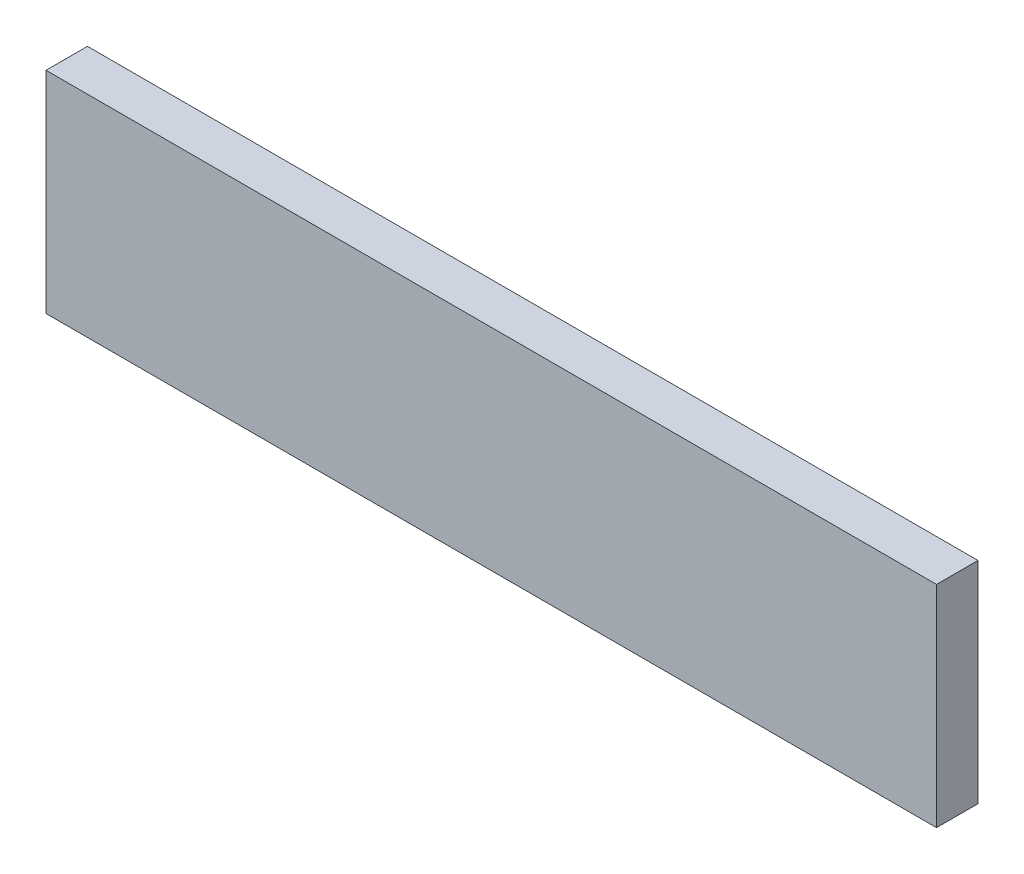
ISO-10303-21;
HEADER;
FILE_DESCRIPTION(('STEP AP214'),'2;1');
FILE_NAME('part.step','',(''),(''),'','','');
FILE_SCHEMA(('AUTOMOTIVE_DESIGN { 1 0 10303 214 1 1 1 1 }'));
ENDSEC;
DATA;
#1=APPLICATION_CONTEXT('core data for automotive mechanical design processes');
#2=APPLICATION_PROTOCOL_DEFINITION('international standard','automotive_design',2000,#1);
#3=PRODUCT_CONTEXT('',#1,'mechanical');
#4=PRODUCT('Part','Part','',(#3));
#5=PRODUCT_RELATED_PRODUCT_CATEGORY('part','',(#4));
#6=PRODUCT_DEFINITION_FORMATION('','',#4);
#7=PRODUCT_DEFINITION_CONTEXT('part definition',#1,'design');
#8=PRODUCT_DEFINITION('design','',#6,#7);
#9=PRODUCT_DEFINITION_SHAPE('','',#8);
#10=(LENGTH_UNIT() NAMED_UNIT(*) SI_UNIT(.MILLI.,.METRE.));
#11=(NAMED_UNIT(*) PLANE_ANGLE_UNIT() SI_UNIT($,.RADIAN.));
#12=(NAMED_UNIT(*) SI_UNIT($,.STERADIAN.) SOLID_ANGLE_UNIT());
#13=UNCERTAINTY_MEASURE_WITH_UNIT(LENGTH_MEASURE(1.E-05),#10,'distance_accuracy_value','');
#14=(GEOMETRIC_REPRESENTATION_CONTEXT(3) GLOBAL_UNCERTAINTY_ASSIGNED_CONTEXT((#13)) GLOBAL_UNIT_ASSIGNED_CONTEXT((#10,
#11,#12)) REPRESENTATION_CONTEXT('',''));
#15=CARTESIAN_POINT('',(0.,0.,0.));
#16=DIRECTION('',(0.,0.,1.));
#17=DIRECTION('',(1.,0.,0.));
#18=AXIS2_PLACEMENT_3D('',#15,#16,#17);
#19=CARTESIAN_POINT('',(0.,0.,15.));
#20=DIRECTION('',(1.,0.,0.));
#21=DIRECTION('',(0.,0.,-1.));
#22=AXIS2_PLACEMENT_3D('',#19,#20,#21);
#23=PLANE('',#22);
#24=DIRECTION('',(0.,-1.,0.));
#25=VECTOR('',#24,1.);
#26=CARTESIAN_POINT('',(0.,0.,0.));
#27=LINE('',#26,#25);
#28=CARTESIAN_POINT('',(0.,76.2,0.));
#29=VERTEX_POINT('',#28);
#30=CARTESIAN_POINT('',(0.,0.,0.));
#31=VERTEX_POINT('',#30);
#32=EDGE_CURVE('E96',#29,#31,#27,.T.);
#33=ORIENTED_EDGE('',*,*,#32,.T.);
#34=DIRECTION('',(0.,0.,-1.));
#35=VECTOR('',#34,1.);
#36=CARTESIAN_POINT('',(0.,0.,15.));
#37=LINE('',#36,#35);
#38=CARTESIAN_POINT('',(0.,0.,15.));
#39=VERTEX_POINT('',#38);
#40=EDGE_CURVE('E11',#39,#31,#37,.T.);
#41=ORIENTED_EDGE('',*,*,#40,.F.);
#42=DIRECTION('',(0.,-1.,0.));
#43=VECTOR('',#42,1.);
#44=CARTESIAN_POINT('',(0.,0.,15.));
#45=LINE('',#44,#43);
#46=CARTESIAN_POINT('',(0.,76.2,15.));
#47=VERTEX_POINT('',#46);
#48=EDGE_CURVE('E84',#47,#39,#45,.T.);
#49=ORIENTED_EDGE('',*,*,#48,.F.);
#50=DIRECTION('',(0.,0.,-1.));
#51=VECTOR('',#50,1.);
#52=CARTESIAN_POINT('',(0.,76.2,15.));
#53=LINE('',#52,#51);
#54=EDGE_CURVE('E92',#47,#29,#53,.T.);
#55=ORIENTED_EDGE('',*,*,#54,.T.);
#56=EDGE_LOOP('',(#33,#41,#49,#55));
#57=FACE_BOUND('',#56,.T.);
#58=ADVANCED_FACE('F33',(#57),#23,.F.);
#59=CARTESIAN_POINT('',(0.,0.,15.));
#60=DIRECTION('',(0.,1.,0.));
#61=DIRECTION('',(0.,0.,1.));
#62=AXIS2_PLACEMENT_3D('',#59,#60,#61);
#63=PLANE('',#62);
#64=DIRECTION('',(1.,0.,0.));
#65=VECTOR('',#64,1.);
#66=CARTESIAN_POINT('',(0.,0.,0.));
#67=LINE('',#66,#65);
#68=CARTESIAN_POINT('',(322.1,0.,0.));
#69=VERTEX_POINT('',#68);
#70=EDGE_CURVE('E88',#31,#69,#67,.T.);
#71=ORIENTED_EDGE('',*,*,#70,.T.);
#72=DIRECTION('',(0.,0.,-1.));
#73=VECTOR('',#72,1.);
#74=CARTESIAN_POINT('',(322.1,0.,15.));
#75=LINE('',#74,#73);
#76=CARTESIAN_POINT('',(322.1,0.,15.));
#77=VERTEX_POINT('',#76);
#78=EDGE_CURVE('E41',#77,#69,#75,.T.);
#79=ORIENTED_EDGE('',*,*,#78,.F.);
#80=DIRECTION('',(1.,0.,0.));
#81=VECTOR('',#80,1.);
#82=CARTESIAN_POINT('',(0.,0.,15.));
#83=LINE('',#82,#81);
#84=EDGE_CURVE('E79',#39,#77,#83,.T.);
#85=ORIENTED_EDGE('',*,*,#84,.F.);
#86=ORIENTED_EDGE('',*,*,#40,.T.);
#87=EDGE_LOOP('',(#71,#79,#85,#86));
#88=FACE_BOUND('',#87,.T.);
#89=ADVANCED_FACE('F87',(#88),#63,.F.);
#90=CARTESIAN_POINT('',(322.1,0.,15.));
#91=DIRECTION('',(-1.,0.,0.));
#92=DIRECTION('',(0.,0.,1.));
#93=AXIS2_PLACEMENT_3D('',#90,#91,#92);
#94=PLANE('',#93);
#95=DIRECTION('',(0.,1.,0.));
#96=VECTOR('',#95,1.);
#97=CARTESIAN_POINT('',(322.1,0.,0.));
#98=LINE('',#97,#96);
#99=CARTESIAN_POINT('',(322.1,76.2,0.));
#100=VERTEX_POINT('',#99);
#101=EDGE_CURVE('E66',#69,#100,#98,.T.);
#102=ORIENTED_EDGE('',*,*,#101,.T.);
#103=DIRECTION('',(0.,0.,-1.));
#104=VECTOR('',#103,1.);
#105=CARTESIAN_POINT('',(322.1,76.2,15.));
#106=LINE('',#105,#104);
#107=CARTESIAN_POINT('',(322.1,76.2,15.));
#108=VERTEX_POINT('',#107);
#109=EDGE_CURVE('E89',#108,#100,#106,.T.);
#110=ORIENTED_EDGE('',*,*,#109,.F.);
#111=DIRECTION('',(0.,1.,0.));
#112=VECTOR('',#111,1.);
#113=CARTESIAN_POINT('',(322.1,0.,15.));
#114=LINE('',#113,#112);
#115=EDGE_CURVE('E82',#77,#108,#114,.T.);
#116=ORIENTED_EDGE('',*,*,#115,.F.);
#117=ORIENTED_EDGE('',*,*,#78,.T.);
#118=EDGE_LOOP('',(#102,#110,#116,#117));
#119=FACE_BOUND('',#118,.T.);
#120=ADVANCED_FACE('F90',(#119),#94,.F.);
#121=CARTESIAN_POINT('',(0.,76.2,15.));
#122=DIRECTION('',(0.,-1.,0.));
#123=DIRECTION('',(0.,0.,-1.));
#124=AXIS2_PLACEMENT_3D('',#121,#122,#123);
#125=PLANE('',#124);
#126=DIRECTION('',(-1.,0.,0.));
#127=VECTOR('',#126,1.);
#128=CARTESIAN_POINT('',(0.,76.2,0.));
#129=LINE('',#128,#127);
#130=EDGE_CURVE('E72',#100,#29,#129,.T.);
#131=ORIENTED_EDGE('',*,*,#130,.T.);
#132=ORIENTED_EDGE('',*,*,#54,.F.);
#133=DIRECTION('',(-1.,0.,0.));
#134=VECTOR('',#133,1.);
#135=CARTESIAN_POINT('',(0.,76.2,15.));
#136=LINE('',#135,#134);
#137=EDGE_CURVE('E49',#108,#47,#136,.T.);
#138=ORIENTED_EDGE('',*,*,#137,.F.);
#139=ORIENTED_EDGE('',*,*,#109,.T.);
#140=EDGE_LOOP('',(#131,#132,#138,#139));
#141=FACE_BOUND('',#140,.T.);
#142=ADVANCED_FACE('F103',(#141),#125,.F.);
#143=CARTESIAN_POINT('',(0.,0.,15.));
#144=DIRECTION('',(0.,0.,-1.));
#145=DIRECTION('',(-1.,0.,0.));
#146=AXIS2_PLACEMENT_3D('',#143,#144,#145);
#147=PLANE('',#146);
#148=ORIENTED_EDGE('',*,*,#48,.T.);
#149=ORIENTED_EDGE('',*,*,#84,.T.);
#150=ORIENTED_EDGE('',*,*,#115,.T.);
#151=ORIENTED_EDGE('',*,*,#137,.T.);
#152=EDGE_LOOP('',(#148,#149,#150,#151));
#153=FACE_BOUND('',#152,.T.);
#154=ADVANCED_FACE('F80',(#153),#147,.F.);
#155=CARTESIAN_POINT('',(0.,0.,0.));
#156=DIRECTION('',(0.,0.,-1.));
#157=DIRECTION('',(-1.,0.,0.));
#158=AXIS2_PLACEMENT_3D('',#155,#156,#157);
#159=PLANE('',#158);
#160=ORIENTED_EDGE('',*,*,#32,.F.);
#161=ORIENTED_EDGE('',*,*,#130,.F.);
#162=ORIENTED_EDGE('',*,*,#101,.F.);
#163=ORIENTED_EDGE('',*,*,#70,.F.);
#164=EDGE_LOOP('',(#160,#161,#162,#163));
#165=FACE_BOUND('',#164,.T.);
#166=ADVANCED_FACE('F106',(#165),#159,.T.);
#167=CLOSED_SHELL('',(#58,#89,#120,#142,#154,#166));
#168=MANIFOLD_SOLID_BREP('B2',#167);
#169=ADVANCED_BREP_SHAPE_REPRESENTATION('',(#18,#168),#14);
#170=SHAPE_DEFINITION_REPRESENTATION(#9,#169);
ENDSEC;
END-ISO-10303-21;
